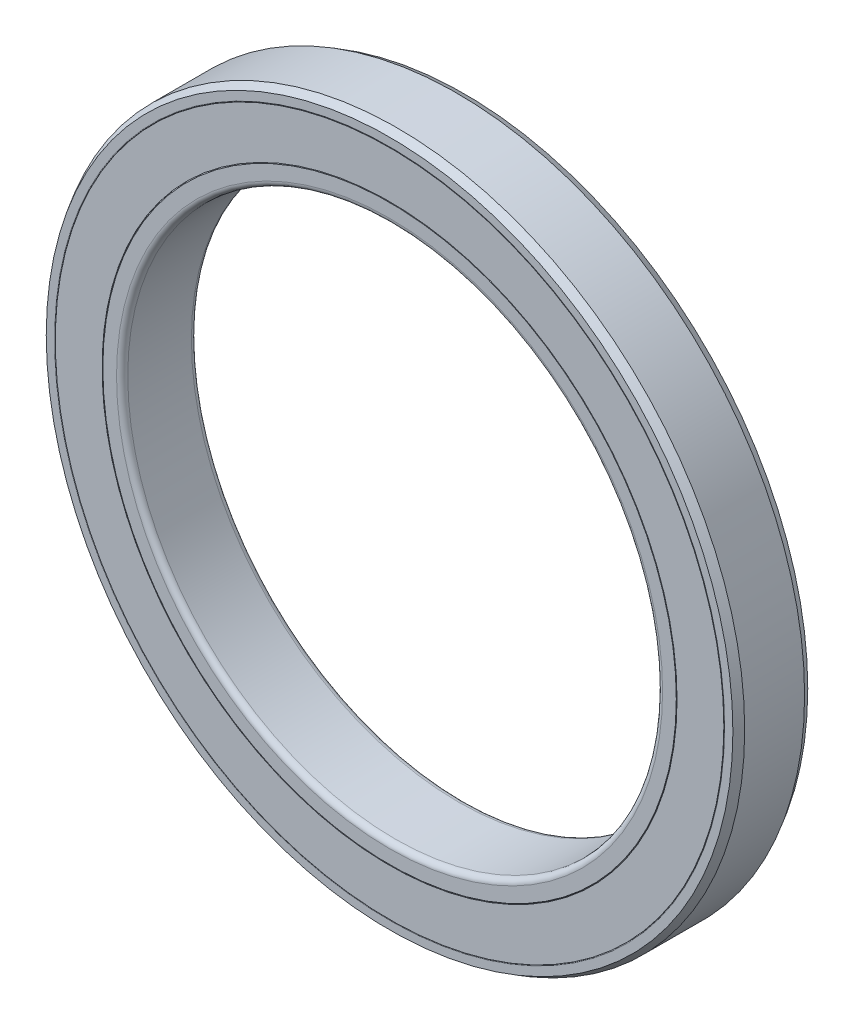
ISO-10303-21;
HEADER;
FILE_DESCRIPTION(('STEP AP214'),'2;1');
FILE_NAME('part.step','',(''),(''),'','','');
FILE_SCHEMA(('AUTOMOTIVE_DESIGN { 1 0 10303 214 1 1 1 1 }'));
ENDSEC;
DATA;
#1=APPLICATION_CONTEXT('core data for automotive mechanical design processes');
#2=APPLICATION_PROTOCOL_DEFINITION('international standard','automotive_design',2000,#1);
#3=PRODUCT_CONTEXT('',#1,'mechanical');
#4=PRODUCT('Part','Part','',(#3));
#5=PRODUCT_RELATED_PRODUCT_CATEGORY('part','',(#4));
#6=PRODUCT_DEFINITION_FORMATION('','',#4);
#7=PRODUCT_DEFINITION_CONTEXT('part definition',#1,'design');
#8=PRODUCT_DEFINITION('design','',#6,#7);
#9=PRODUCT_DEFINITION_SHAPE('','',#8);
#10=(LENGTH_UNIT() NAMED_UNIT(*) SI_UNIT(.MILLI.,.METRE.));
#11=(NAMED_UNIT(*) PLANE_ANGLE_UNIT() SI_UNIT($,.RADIAN.));
#12=(NAMED_UNIT(*) SI_UNIT($,.STERADIAN.) SOLID_ANGLE_UNIT());
#13=UNCERTAINTY_MEASURE_WITH_UNIT(LENGTH_MEASURE(1.E-05),#10,'distance_accuracy_value','');
#14=(GEOMETRIC_REPRESENTATION_CONTEXT(3) GLOBAL_UNCERTAINTY_ASSIGNED_CONTEXT((#13)) GLOBAL_UNIT_ASSIGNED_CONTEXT((#10,
#11,#12)) REPRESENTATION_CONTEXT('',''));
#15=CARTESIAN_POINT('',(0.,0.,0.));
#16=DIRECTION('',(0.,0.,1.));
#17=DIRECTION('',(1.,0.,0.));
#18=AXIS2_PLACEMENT_3D('',#15,#16,#17);
#19=CARTESIAN_POINT('',(22.7219774592269,-18.1201723665197,0.));
#20=DIRECTION('',(-0.781831482468022,0.623489801858743,0.));
#21=DIRECTION('',(0.,0.,1.));
#22=AXIS2_PLACEMENT_3D('',#19,#20,#21);
#23=SPHERICAL_SURFACE('',#22,3.02083333333333);
#24=CARTESIAN_POINT('',(20.3601948559381,-16.2367135900714,0.));
#25=VERTEX_POINT('',#24);
#26=VERTEX_LOOP('',#25);
#27=FACE_BOUND('',#26,.T.);
#28=ADVANCED_FACE('F46',(#27),#23,.T.);
#29=CLOSED_SHELL('',(#28));
#30=MANIFOLD_SOLID_BREP('B2',#29);
#31=CARTESIAN_POINT('',(28.3338424477843,6.46701464310512,0.));
#32=DIRECTION('',(-0.974927912181826,-0.222520933956305,0.));
#33=DIRECTION('',(0.,0.,1.));
#34=AXIS2_PLACEMENT_3D('',#31,#32,#33);
#35=SPHERICAL_SURFACE('',#34,3.02083333333333);
#36=CARTESIAN_POINT('',(25.3887477130684,5.79481598844544,0.));
#37=VERTEX_POINT('',#36);
#38=VERTEX_LOOP('',#37);
#39=FACE_BOUND('',#38,.T.);
#40=ADVANCED_FACE('F63',(#39),#35,.T.);
#41=CLOSED_SHELL('',(#40));
#42=MANIFOLD_SOLID_BREP('B6',#41);
#43=CARTESIAN_POINT('',(12.6097461681042,26.184407723414,0.));
#44=DIRECTION('',(-0.433883739117565,-0.900968867902416,0.));
#45=DIRECTION('',(0.,0.,1.));
#46=AXIS2_PLACEMENT_3D('',#43,#44,#45);
#47=SPHERICAL_SURFACE('',#46,3.02083333333333);
#48=CARTESIAN_POINT('',(11.2990557061866,23.4627309349587,0.));
#49=VERTEX_POINT('',#48);
#50=VERTEX_LOOP('',#49);
#51=FACE_BOUND('',#50,.T.);
#52=ADVANCED_FACE('F80',(#51),#47,.T.);
#53=CLOSED_SHELL('',(#52));
#54=MANIFOLD_SOLID_BREP('B42',#53);
#55=CARTESIAN_POINT('',(-12.6097461681039,26.1844077234141,0.));
#56=DIRECTION('',(0.433883739117553,-0.900968867902422,0.));
#57=DIRECTION('',(0.,0.,1.));
#58=AXIS2_PLACEMENT_3D('',#55,#56,#57);
#59=SPHERICAL_SURFACE('',#58,3.02083333333333);
#60=CARTESIAN_POINT('',(-11.2990557061863,23.4627309349589,0.));
#61=VERTEX_POINT('',#60);
#62=VERTEX_LOOP('',#61);
#63=FACE_BOUND('',#62,.T.);
#64=ADVANCED_FACE('F97',(#63),#59,.T.);
#65=CLOSED_SHELL('',(#64));
#66=MANIFOLD_SOLID_BREP('B59',#65);
#67=CARTESIAN_POINT('',(-28.3338424477842,6.4670146431055,0.));
#68=DIRECTION('',(0.974927912181823,-0.222520933956318,0.));
#69=DIRECTION('',(0.,0.,1.));
#70=AXIS2_PLACEMENT_3D('',#67,#68,#69);
#71=SPHERICAL_SURFACE('',#70,3.02083333333333);
#72=CARTESIAN_POINT('',(-25.3887477130683,5.79481598844579,0.));
#73=VERTEX_POINT('',#72);
#74=VERTEX_LOOP('',#73);
#75=FACE_BOUND('',#74,.T.);
#76=ADVANCED_FACE('F114',(#75),#71,.T.);
#77=CLOSED_SHELL('',(#76));
#78=MANIFOLD_SOLID_BREP('B76',#77);
#79=CARTESIAN_POINT('',(-22.7219774592272,-18.1201723665194,0.));
#80=DIRECTION('',(0.781831482468031,0.623489801858732,0.));
#81=DIRECTION('',(0.,0.,1.));
#82=AXIS2_PLACEMENT_3D('',#79,#80,#81);
#83=SPHERICAL_SURFACE('',#82,3.02083333333333);
#84=CARTESIAN_POINT('',(-20.3601948559383,-16.2367135900711,0.));
#85=VERTEX_POINT('',#84);
#86=VERTEX_LOOP('',#85);
#87=FACE_BOUND('',#86,.T.);
#88=ADVANCED_FACE('F131',(#87),#83,.T.);
#89=CLOSED_SHELL('',(#88));
#90=MANIFOLD_SOLID_BREP('B93',#89);
#91=CARTESIAN_POINT('',(0.,-29.0625,0.));
#92=DIRECTION('',(0.,1.,0.));
#93=DIRECTION('',(0.,0.,1.));
#94=AXIS2_PLACEMENT_3D('',#91,#92,#93);
#95=SPHERICAL_SURFACE('',#94,3.02083333333333);
#96=CARTESIAN_POINT('',(0.,-26.0416666666667,0.));
#97=VERTEX_POINT('',#96);
#98=VERTEX_LOOP('',#97);
#99=FACE_BOUND('',#98,.T.);
#100=ADVANCED_FACE('F150',(#99),#95,.T.);
#101=CLOSED_SHELL('',(#100));
#102=MANIFOLD_SOLID_BREP('B110',#101);
#103=CARTESIAN_POINT('',(0.,-26.875,3.5));
#104=DIRECTION('',(0.,0.,1.));
#105=DIRECTION('',(1.,0.,0.));
#106=AXIS2_PLACEMENT_3D('',#103,#104,#105);
#107=PLANE('',#106);
#108=CARTESIAN_POINT('',(0.,0.,3.5));
#109=DIRECTION('',(0.,0.,1.));
#110=DIRECTION('',(1.,0.,0.));
#111=AXIS2_PLACEMENT_3D('',#108,#109,#110);
#112=CIRCLE('',#111,31.25);
#113=CARTESIAN_POINT('',(31.25,0.,3.5));
#114=VERTEX_POINT('',#113);
#115=EDGE_CURVE('E149',#114,#114,#112,.T.);
#116=ORIENTED_EDGE('',*,*,#115,.T.);
#117=EDGE_LOOP('',(#116));
#118=FACE_BOUND('',#117,.T.);
#119=CARTESIAN_POINT('',(0.,0.,3.5));
#120=DIRECTION('',(0.,0.,1.));
#121=DIRECTION('',(1.,0.,0.));
#122=AXIS2_PLACEMENT_3D('',#119,#120,#121);
#123=CIRCLE('',#122,26.875);
#124=CARTESIAN_POINT('',(26.875,0.,3.5));
#125=VERTEX_POINT('',#124);
#126=EDGE_CURVE('E183',#125,#125,#123,.T.);
#127=ORIENTED_EDGE('',*,*,#126,.F.);
#128=EDGE_LOOP('',(#127));
#129=FACE_BOUND('',#128,.T.);
#130=ADVANCED_FACE('F169',(#118,#129),#107,.T.);
#131=CARTESIAN_POINT('',(0.,0.,3.5));
#132=DIRECTION('',(0.,0.,1.));
#133=DIRECTION('',(1.,0.,0.));
#134=AXIS2_PLACEMENT_3D('',#131,#132,#133);
#135=CYLINDRICAL_SURFACE('',#134,31.25);
#136=CARTESIAN_POINT('',(0.,0.,3.140625));
#137=DIRECTION('',(0.,0.,1.));
#138=DIRECTION('',(1.,0.,0.));
#139=AXIS2_PLACEMENT_3D('',#136,#137,#138);
#140=CIRCLE('',#139,31.25);
#141=CARTESIAN_POINT('',(31.25,0.,3.140625));
#142=VERTEX_POINT('',#141);
#143=EDGE_CURVE('E175',#142,#142,#140,.T.);
#144=ORIENTED_EDGE('',*,*,#143,.T.);
#145=EDGE_LOOP('',(#144));
#146=FACE_BOUND('',#145,.T.);
#147=ORIENTED_EDGE('',*,*,#115,.F.);
#148=EDGE_LOOP('',(#147));
#149=FACE_BOUND('',#148,.T.);
#150=ADVANCED_FACE('F193',(#146,#149),#135,.T.);
#151=CARTESIAN_POINT('',(0.,-26.875,3.140625));
#152=DIRECTION('',(0.,0.,-1.));
#153=DIRECTION('',(-1.,0.,0.));
#154=AXIS2_PLACEMENT_3D('',#151,#152,#153);
#155=PLANE('',#154);
#156=CARTESIAN_POINT('',(0.,0.,3.140625));
#157=DIRECTION('',(0.,0.,1.));
#158=DIRECTION('',(1.,0.,0.));
#159=AXIS2_PLACEMENT_3D('',#156,#157,#158);
#160=CIRCLE('',#159,26.875);
#161=CARTESIAN_POINT('',(26.875,0.,3.140625));
#162=VERTEX_POINT('',#161);
#163=EDGE_CURVE('E179',#162,#162,#160,.T.);
#164=ORIENTED_EDGE('',*,*,#163,.T.);
#165=EDGE_LOOP('',(#164));
#166=FACE_BOUND('',#165,.T.);
#167=ORIENTED_EDGE('',*,*,#143,.F.);
#168=EDGE_LOOP('',(#167));
#169=FACE_BOUND('',#168,.T.);
#170=ADVANCED_FACE('F197',(#166,#169),#155,.T.);
#171=CARTESIAN_POINT('',(0.,0.,3.5));
#172=DIRECTION('',(0.,0.,1.));
#173=DIRECTION('',(1.,0.,0.));
#174=AXIS2_PLACEMENT_3D('',#171,#172,#173);
#175=CYLINDRICAL_SURFACE('',#174,26.875);
#176=ORIENTED_EDGE('',*,*,#126,.T.);
#177=EDGE_LOOP('',(#176));
#178=FACE_BOUND('',#177,.T.);
#179=ORIENTED_EDGE('',*,*,#163,.F.);
#180=EDGE_LOOP('',(#179));
#181=FACE_BOUND('',#180,.T.);
#182=ADVANCED_FACE('F189',(#178,#181),#175,.F.);
#183=CLOSED_SHELL('',(#130,#150,#170,#182));
#184=MANIFOLD_SOLID_BREP('B127',#183);
#185=CARTESIAN_POINT('',(0.,0.,2.975));
#186=DIRECTION('',(0.,0.,1.));
#187=DIRECTION('',(1.,0.,0.));
#188=AXIS2_PLACEMENT_3D('',#185,#186,#187);
#189=TOROIDAL_SURFACE('',#188,25.525,0.525);
#190=CARTESIAN_POINT('',(0.,0.,3.5));
#191=DIRECTION('',(0.,0.,1.));
#192=DIRECTION('',(1.,0.,0.));
#193=AXIS2_PLACEMENT_3D('',#190,#191,#192);
#194=CIRCLE('',#193,25.525);
#195=CARTESIAN_POINT('',(25.525,0.,3.5));
#196=VERTEX_POINT('',#195);
#197=EDGE_CURVE('E168',#196,#196,#194,.T.);
#198=ORIENTED_EDGE('',*,*,#197,.T.);
#199=EDGE_LOOP('',(#198));
#200=FACE_BOUND('',#199,.T.);
#201=CARTESIAN_POINT('',(0.,0.,2.975));
#202=DIRECTION('',(0.,0.,1.));
#203=DIRECTION('',(1.,0.,0.));
#204=AXIS2_PLACEMENT_3D('',#201,#202,#203);
#205=CIRCLE('',#204,25.);
#206=CARTESIAN_POINT('',(25.,0.,2.975));
#207=VERTEX_POINT('',#206);
#208=EDGE_CURVE('E264',#207,#207,#205,.T.);
#209=ORIENTED_EDGE('',*,*,#208,.F.);
#210=EDGE_LOOP('',(#209));
#211=FACE_BOUND('',#210,.T.);
#212=ADVANCED_FACE('F230',(#200,#211),#189,.T.);
#213=CARTESIAN_POINT('',(0.,-26.805,3.5));
#214=DIRECTION('',(0.,0.,1.));
#215=DIRECTION('',(1.,0.,0.));
#216=AXIS2_PLACEMENT_3D('',#213,#214,#215);
#217=PLANE('',#216);
#218=CARTESIAN_POINT('',(0.,0.,3.5));
#219=DIRECTION('',(0.,0.,1.));
#220=DIRECTION('',(1.,0.,0.));
#221=AXIS2_PLACEMENT_3D('',#218,#219,#220);
#222=CIRCLE('',#221,26.805);
#223=CARTESIAN_POINT('',(26.805,0.,3.5));
#224=VERTEX_POINT('',#223);
#225=EDGE_CURVE('E236',#224,#224,#222,.T.);
#226=ORIENTED_EDGE('',*,*,#225,.T.);
#227=EDGE_LOOP('',(#226));
#228=FACE_BOUND('',#227,.T.);
#229=ORIENTED_EDGE('',*,*,#197,.F.);
#230=EDGE_LOOP('',(#229));
#231=FACE_BOUND('',#230,.T.);
#232=ADVANCED_FACE('F272',(#228,#231),#217,.T.);
#233=CARTESIAN_POINT('',(0.,0.,3.5));
#234=DIRECTION('',(0.,0.,-1.));
#235=DIRECTION('',(-1.,0.,0.));
#236=AXIS2_PLACEMENT_3D('',#233,#234,#235);
#237=CONICAL_SURFACE('',#236,26.805,0.78539816339743);
#238=CARTESIAN_POINT('',(0.,0.,3.43));
#239=DIRECTION('',(0.,0.,1.));
#240=DIRECTION('',(1.,0.,0.));
#241=AXIS2_PLACEMENT_3D('',#238,#239,#240);
#242=CIRCLE('',#241,26.875);
#243=CARTESIAN_POINT('',(26.875,0.,3.43));
#244=VERTEX_POINT('',#243);
#245=EDGE_CURVE('E240',#244,#244,#242,.T.);
#246=ORIENTED_EDGE('',*,*,#245,.T.);
#247=EDGE_LOOP('',(#246));
#248=FACE_BOUND('',#247,.T.);
#249=ORIENTED_EDGE('',*,*,#225,.F.);
#250=EDGE_LOOP('',(#249));
#251=FACE_BOUND('',#250,.T.);
#252=ADVANCED_FACE('F276',(#248,#251),#237,.T.);
#253=CARTESIAN_POINT('',(0.,0.,3.5));
#254=DIRECTION('',(0.,0.,1.));
#255=DIRECTION('',(1.,0.,0.));
#256=AXIS2_PLACEMENT_3D('',#253,#254,#255);
#257=CYLINDRICAL_SURFACE('',#256,26.875);
#258=CARTESIAN_POINT('',(0.,0.,2.08333333333333));
#259=DIRECTION('',(0.,0.,1.));
#260=DIRECTION('',(1.,0.,0.));
#261=AXIS2_PLACEMENT_3D('',#258,#259,#260);
#262=CIRCLE('',#261,26.875);
#263=CARTESIAN_POINT('',(26.875,0.,2.08333333333333));
#264=VERTEX_POINT('',#263);
#265=EDGE_CURVE('E244',#264,#264,#262,.T.);
#266=ORIENTED_EDGE('',*,*,#265,.T.);
#267=EDGE_LOOP('',(#266));
#268=FACE_BOUND('',#267,.T.);
#269=ORIENTED_EDGE('',*,*,#245,.F.);
#270=EDGE_LOOP('',(#269));
#271=FACE_BOUND('',#270,.T.);
#272=ADVANCED_FACE('F280',(#268,#271),#257,.T.);
#273=CARTESIAN_POINT('',(0.,0.,0.));
#274=DIRECTION('',(0.,0.,1.));
#275=DIRECTION('',(1.,0.,0.));
#276=AXIS2_PLACEMENT_3D('',#273,#274,#275);
#277=TOROIDAL_SURFACE('',#276,29.0625,3.02083333333333);
#278=CARTESIAN_POINT('',(0.,0.,-2.08333333333333));
#279=DIRECTION('',(0.,0.,1.));
#280=DIRECTION('',(1.,0.,0.));
#281=AXIS2_PLACEMENT_3D('',#278,#279,#280);
#282=CIRCLE('',#281,26.875);
#283=CARTESIAN_POINT('',(26.875,0.,-2.08333333333333));
#284=VERTEX_POINT('',#283);
#285=EDGE_CURVE('E249',#284,#284,#282,.T.);
#286=ORIENTED_EDGE('',*,*,#285,.T.);
#287=EDGE_LOOP('',(#286));
#288=FACE_BOUND('',#287,.T.);
#289=ORIENTED_EDGE('',*,*,#265,.F.);
#290=EDGE_LOOP('',(#289));
#291=FACE_BOUND('',#290,.T.);
#292=ADVANCED_FACE('F287',(#288,#291),#277,.F.);
#293=CARTESIAN_POINT('',(0.,0.,3.5));
#294=DIRECTION('',(0.,0.,1.));
#295=DIRECTION('',(1.,0.,0.));
#296=AXIS2_PLACEMENT_3D('',#293,#294,#295);
#297=CYLINDRICAL_SURFACE('',#296,26.875);
#298=CARTESIAN_POINT('',(0.,0.,-3.43));
#299=DIRECTION('',(0.,0.,1.));
#300=DIRECTION('',(1.,0.,0.));
#301=AXIS2_PLACEMENT_3D('',#298,#299,#300);
#302=CIRCLE('',#301,26.875);
#303=CARTESIAN_POINT('',(26.875,0.,-3.43));
#304=VERTEX_POINT('',#303);
#305=EDGE_CURVE('E252',#304,#304,#302,.T.);
#306=ORIENTED_EDGE('',*,*,#305,.T.);
#307=EDGE_LOOP('',(#306));
#308=FACE_BOUND('',#307,.T.);
#309=ORIENTED_EDGE('',*,*,#285,.F.);
#310=EDGE_LOOP('',(#309));
#311=FACE_BOUND('',#310,.T.);
#312=ADVANCED_FACE('F291',(#308,#311),#297,.T.);
#313=CARTESIAN_POINT('',(0.,0.,-3.43));
#314=DIRECTION('',(0.,0.,1.));
#315=DIRECTION('',(1.,0.,0.));
#316=AXIS2_PLACEMENT_3D('',#313,#314,#315);
#317=CONICAL_SURFACE('',#316,26.875,0.78539816339743);
#318=CARTESIAN_POINT('',(0.,0.,-3.5));
#319=DIRECTION('',(0.,0.,1.));
#320=DIRECTION('',(1.,0.,0.));
#321=AXIS2_PLACEMENT_3D('',#318,#319,#320);
#322=CIRCLE('',#321,26.805);
#323=CARTESIAN_POINT('',(26.805,0.,-3.5));
#324=VERTEX_POINT('',#323);
#325=EDGE_CURVE('E255',#324,#324,#322,.T.);
#326=ORIENTED_EDGE('',*,*,#325,.T.);
#327=EDGE_LOOP('',(#326));
#328=FACE_BOUND('',#327,.T.);
#329=ORIENTED_EDGE('',*,*,#305,.F.);
#330=EDGE_LOOP('',(#329));
#331=FACE_BOUND('',#330,.T.);
#332=ADVANCED_FACE('F295',(#328,#331),#317,.T.);
#333=CARTESIAN_POINT('',(0.,-26.805,-3.5));
#334=DIRECTION('',(0.,0.,-1.));
#335=DIRECTION('',(-1.,0.,0.));
#336=AXIS2_PLACEMENT_3D('',#333,#334,#335);
#337=PLANE('',#336);
#338=CARTESIAN_POINT('',(0.,0.,-3.5));
#339=DIRECTION('',(0.,0.,1.));
#340=DIRECTION('',(1.,0.,0.));
#341=AXIS2_PLACEMENT_3D('',#338,#339,#340);
#342=CIRCLE('',#341,25.525);
#343=CARTESIAN_POINT('',(25.525,0.,-3.5));
#344=VERTEX_POINT('',#343);
#345=EDGE_CURVE('E258',#344,#344,#342,.T.);
#346=ORIENTED_EDGE('',*,*,#345,.T.);
#347=EDGE_LOOP('',(#346));
#348=FACE_BOUND('',#347,.T.);
#349=ORIENTED_EDGE('',*,*,#325,.F.);
#350=EDGE_LOOP('',(#349));
#351=FACE_BOUND('',#350,.T.);
#352=ADVANCED_FACE('F299',(#348,#351),#337,.T.);
#353=CARTESIAN_POINT('',(0.,0.,-2.975));
#354=DIRECTION('',(0.,0.,1.));
#355=DIRECTION('',(1.,0.,0.));
#356=AXIS2_PLACEMENT_3D('',#353,#354,#355);
#357=TOROIDAL_SURFACE('',#356,25.525,0.525);
#358=CARTESIAN_POINT('',(0.,0.,-2.975));
#359=DIRECTION('',(0.,0.,1.));
#360=DIRECTION('',(1.,0.,0.));
#361=AXIS2_PLACEMENT_3D('',#358,#359,#360);
#362=CIRCLE('',#361,25.);
#363=CARTESIAN_POINT('',(25.,0.,-2.975));
#364=VERTEX_POINT('',#363);
#365=EDGE_CURVE('E261',#364,#364,#362,.T.);
#366=ORIENTED_EDGE('',*,*,#365,.T.);
#367=EDGE_LOOP('',(#366));
#368=FACE_BOUND('',#367,.T.);
#369=ORIENTED_EDGE('',*,*,#345,.F.);
#370=EDGE_LOOP('',(#369));
#371=FACE_BOUND('',#370,.T.);
#372=ADVANCED_FACE('F303',(#368,#371),#357,.T.);
#373=CARTESIAN_POINT('',(0.,0.,3.5));
#374=DIRECTION('',(0.,0.,1.));
#375=DIRECTION('',(1.,0.,0.));
#376=AXIS2_PLACEMENT_3D('',#373,#374,#375);
#377=CYLINDRICAL_SURFACE('',#376,25.);
#378=ORIENTED_EDGE('',*,*,#208,.T.);
#379=EDGE_LOOP('',(#378));
#380=FACE_BOUND('',#379,.T.);
#381=ORIENTED_EDGE('',*,*,#365,.F.);
#382=EDGE_LOOP('',(#381));
#383=FACE_BOUND('',#382,.T.);
#384=ADVANCED_FACE('F268',(#380,#383),#377,.F.);
#385=CLOSED_SHELL('',(#212,#232,#252,#272,#292,#312,#332,#352,#372,#384));
#386=MANIFOLD_SOLID_BREP('B144',#385);
#387=CARTESIAN_POINT('',(0.,0.,3.5));
#388=DIRECTION('',(0.,0.,-1.));
#389=DIRECTION('',(-1.,0.,0.));
#390=AXIS2_PLACEMENT_3D('',#387,#388,#389);
#391=CONICAL_SURFACE('',#390,32.0958548115673,0.523598775598285);
#392=CARTESIAN_POINT('',(0.,0.,2.8));
#393=DIRECTION('',(0.,0.,1.));
#394=DIRECTION('',(1.,0.,0.));
#395=AXIS2_PLACEMENT_3D('',#392,#393,#394);
#396=CIRCLE('',#395,32.5);
#397=CARTESIAN_POINT('',(32.5,0.,2.8));
#398=VERTEX_POINT('',#397);
#399=EDGE_CURVE('E229',#398,#398,#396,.T.);
#400=ORIENTED_EDGE('',*,*,#399,.T.);
#401=EDGE_LOOP('',(#400));
#402=FACE_BOUND('',#401,.T.);
#403=CARTESIAN_POINT('',(0.,0.,3.5));
#404=DIRECTION('',(0.,0.,1.));
#405=DIRECTION('',(1.,0.,0.));
#406=AXIS2_PLACEMENT_3D('',#403,#404,#405);
#407=CIRCLE('',#406,32.0958548115673);
#408=CARTESIAN_POINT('',(32.0958548115673,0.,3.5));
#409=VERTEX_POINT('',#408);
#410=EDGE_CURVE('E396',#409,#409,#407,.T.);
#411=ORIENTED_EDGE('',*,*,#410,.F.);
#412=EDGE_LOOP('',(#411));
#413=FACE_BOUND('',#412,.T.);
#414=ADVANCED_FACE('F362',(#402,#413),#391,.T.);
#415=CARTESIAN_POINT('',(0.,0.,3.5));
#416=DIRECTION('',(0.,0.,1.));
#417=DIRECTION('',(1.,0.,0.));
#418=AXIS2_PLACEMENT_3D('',#415,#416,#417);
#419=CYLINDRICAL_SURFACE('',#418,32.5);
#420=CARTESIAN_POINT('',(0.,0.,-2.8));
#421=DIRECTION('',(0.,0.,1.));
#422=DIRECTION('',(1.,0.,0.));
#423=AXIS2_PLACEMENT_3D('',#420,#421,#422);
#424=CIRCLE('',#423,32.5);
#425=CARTESIAN_POINT('',(32.5,0.,-2.8));
#426=VERTEX_POINT('',#425);
#427=EDGE_CURVE('E368',#426,#426,#424,.T.);
#428=ORIENTED_EDGE('',*,*,#427,.T.);
#429=EDGE_LOOP('',(#428));
#430=FACE_BOUND('',#429,.T.);
#431=ORIENTED_EDGE('',*,*,#399,.F.);
#432=EDGE_LOOP('',(#431));
#433=FACE_BOUND('',#432,.T.);
#434=ADVANCED_FACE('F404',(#430,#433),#419,.T.);
#435=CARTESIAN_POINT('',(0.,0.,-2.8));
#436=DIRECTION('',(0.,0.,1.));
#437=DIRECTION('',(1.,0.,0.));
#438=AXIS2_PLACEMENT_3D('',#435,#436,#437);
#439=CONICAL_SURFACE('',#438,32.5,0.523598775598286);
#440=CARTESIAN_POINT('',(0.,0.,-3.5));
#441=DIRECTION('',(0.,0.,1.));
#442=DIRECTION('',(1.,0.,0.));
#443=AXIS2_PLACEMENT_3D('',#440,#441,#442);
#444=CIRCLE('',#443,32.0958548115673);
#445=CARTESIAN_POINT('',(32.0958548115673,0.,-3.5));
#446=VERTEX_POINT('',#445);
#447=EDGE_CURVE('E372',#446,#446,#444,.T.);
#448=ORIENTED_EDGE('',*,*,#447,.T.);
#449=EDGE_LOOP('',(#448));
#450=FACE_BOUND('',#449,.T.);
#451=ORIENTED_EDGE('',*,*,#427,.F.);
#452=EDGE_LOOP('',(#451));
#453=FACE_BOUND('',#452,.T.);
#454=ADVANCED_FACE('F408',(#450,#453),#439,.T.);
#455=CARTESIAN_POINT('',(0.,-31.32,-3.5));
#456=DIRECTION('',(0.,0.,-1.));
#457=DIRECTION('',(-1.,0.,0.));
#458=AXIS2_PLACEMENT_3D('',#455,#456,#457);
#459=PLANE('',#458);
#460=CARTESIAN_POINT('',(0.,0.,-3.5));
#461=DIRECTION('',(0.,0.,1.));
#462=DIRECTION('',(1.,0.,0.));
#463=AXIS2_PLACEMENT_3D('',#460,#461,#462);
#464=CIRCLE('',#463,31.32);
#465=CARTESIAN_POINT('',(31.32,0.,-3.5));
#466=VERTEX_POINT('',#465);
#467=EDGE_CURVE('E376',#466,#466,#464,.T.);
#468=ORIENTED_EDGE('',*,*,#467,.T.);
#469=EDGE_LOOP('',(#468));
#470=FACE_BOUND('',#469,.T.);
#471=ORIENTED_EDGE('',*,*,#447,.F.);
#472=EDGE_LOOP('',(#471));
#473=FACE_BOUND('',#472,.T.);
#474=ADVANCED_FACE('F412',(#470,#473),#459,.T.);
#475=CARTESIAN_POINT('',(0.,0.,-3.43));
#476=DIRECTION('',(0.,0.,1.));
#477=DIRECTION('',(1.,0.,0.));
#478=AXIS2_PLACEMENT_3D('',#475,#476,#477);
#479=TOROIDAL_SURFACE('',#478,31.32,0.0700000000000037);
#480=CARTESIAN_POINT('',(0.,0.,-3.43));
#481=DIRECTION('',(0.,0.,1.));
#482=DIRECTION('',(1.,0.,0.));
#483=AXIS2_PLACEMENT_3D('',#480,#481,#482);
#484=CIRCLE('',#483,31.25);
#485=CARTESIAN_POINT('',(31.25,0.,-3.43));
#486=VERTEX_POINT('',#485);
#487=EDGE_CURVE('E381',#486,#486,#484,.T.);
#488=ORIENTED_EDGE('',*,*,#487,.T.);
#489=EDGE_LOOP('',(#488));
#490=FACE_BOUND('',#489,.T.);
#491=ORIENTED_EDGE('',*,*,#467,.F.);
#492=EDGE_LOOP('',(#491));
#493=FACE_BOUND('',#492,.T.);
#494=ADVANCED_FACE('F419',(#490,#493),#479,.T.);
#495=CARTESIAN_POINT('',(0.,0.,3.5));
#496=DIRECTION('',(0.,0.,1.));
#497=DIRECTION('',(1.,0.,0.));
#498=AXIS2_PLACEMENT_3D('',#495,#496,#497);
#499=CYLINDRICAL_SURFACE('',#498,31.25);
#500=CARTESIAN_POINT('',(0.,0.,-2.08333333333333));
#501=DIRECTION('',(0.,0.,1.));
#502=DIRECTION('',(1.,0.,0.));
#503=AXIS2_PLACEMENT_3D('',#500,#501,#502);
#504=CIRCLE('',#503,31.25);
#505=CARTESIAN_POINT('',(31.25,0.,-2.08333333333333));
#506=VERTEX_POINT('',#505);
#507=EDGE_CURVE('E384',#506,#506,#504,.T.);
#508=ORIENTED_EDGE('',*,*,#507,.T.);
#509=EDGE_LOOP('',(#508));
#510=FACE_BOUND('',#509,.T.);
#511=ORIENTED_EDGE('',*,*,#487,.F.);
#512=EDGE_LOOP('',(#511));
#513=FACE_BOUND('',#512,.T.);
#514=ADVANCED_FACE('F423',(#510,#513),#499,.F.);
#515=CARTESIAN_POINT('',(0.,0.,0.));
#516=DIRECTION('',(0.,0.,1.));
#517=DIRECTION('',(1.,0.,0.));
#518=AXIS2_PLACEMENT_3D('',#515,#516,#517);
#519=TOROIDAL_SURFACE('',#518,29.0625,3.02083333333333);
#520=CARTESIAN_POINT('',(0.,0.,2.08333333333333));
#521=DIRECTION('',(0.,0.,1.));
#522=DIRECTION('',(1.,0.,0.));
#523=AXIS2_PLACEMENT_3D('',#520,#521,#522);
#524=CIRCLE('',#523,31.25);
#525=CARTESIAN_POINT('',(31.25,0.,2.08333333333333));
#526=VERTEX_POINT('',#525);
#527=EDGE_CURVE('E387',#526,#526,#524,.T.);
#528=ORIENTED_EDGE('',*,*,#527,.T.);
#529=EDGE_LOOP('',(#528));
#530=FACE_BOUND('',#529,.T.);
#531=ORIENTED_EDGE('',*,*,#507,.F.);
#532=EDGE_LOOP('',(#531));
#533=FACE_BOUND('',#532,.T.);
#534=ADVANCED_FACE('F427',(#530,#533),#519,.F.);
#535=CARTESIAN_POINT('',(0.,0.,3.5));
#536=DIRECTION('',(0.,0.,1.));
#537=DIRECTION('',(1.,0.,0.));
#538=AXIS2_PLACEMENT_3D('',#535,#536,#537);
#539=CYLINDRICAL_SURFACE('',#538,31.25);
#540=CARTESIAN_POINT('',(0.,0.,3.43));
#541=DIRECTION('',(0.,0.,1.));
#542=DIRECTION('',(1.,0.,0.));
#543=AXIS2_PLACEMENT_3D('',#540,#541,#542);
#544=CIRCLE('',#543,31.25);
#545=CARTESIAN_POINT('',(31.25,0.,3.43));
#546=VERTEX_POINT('',#545);
#547=EDGE_CURVE('E390',#546,#546,#544,.T.);
#548=ORIENTED_EDGE('',*,*,#547,.T.);
#549=EDGE_LOOP('',(#548));
#550=FACE_BOUND('',#549,.T.);
#551=ORIENTED_EDGE('',*,*,#527,.F.);
#552=EDGE_LOOP('',(#551));
#553=FACE_BOUND('',#552,.T.);
#554=ADVANCED_FACE('F431',(#550,#553),#539,.F.);
#555=CARTESIAN_POINT('',(0.,0.,3.43));
#556=DIRECTION('',(0.,0.,1.));
#557=DIRECTION('',(1.,0.,0.));
#558=AXIS2_PLACEMENT_3D('',#555,#556,#557);
#559=TOROIDAL_SURFACE('',#558,31.32,0.0700000000000037);
#560=CARTESIAN_POINT('',(0.,0.,3.5));
#561=DIRECTION('',(0.,0.,1.));
#562=DIRECTION('',(1.,0.,0.));
#563=AXIS2_PLACEMENT_3D('',#560,#561,#562);
#564=CIRCLE('',#563,31.32);
#565=CARTESIAN_POINT('',(31.32,0.,3.5));
#566=VERTEX_POINT('',#565);
#567=EDGE_CURVE('E393',#566,#566,#564,.T.);
#568=ORIENTED_EDGE('',*,*,#567,.T.);
#569=EDGE_LOOP('',(#568));
#570=FACE_BOUND('',#569,.T.);
#571=ORIENTED_EDGE('',*,*,#547,.F.);
#572=EDGE_LOOP('',(#571));
#573=FACE_BOUND('',#572,.T.);
#574=ADVANCED_FACE('F435',(#570,#573),#559,.T.);
#575=CARTESIAN_POINT('',(0.,-31.32,3.5));
#576=DIRECTION('',(0.,0.,1.));
#577=DIRECTION('',(1.,0.,0.));
#578=AXIS2_PLACEMENT_3D('',#575,#576,#577);
#579=PLANE('',#578);
#580=ORIENTED_EDGE('',*,*,#410,.T.);
#581=EDGE_LOOP('',(#580));
#582=FACE_BOUND('',#581,.T.);
#583=ORIENTED_EDGE('',*,*,#567,.F.);
#584=EDGE_LOOP('',(#583));
#585=FACE_BOUND('',#584,.T.);
#586=ADVANCED_FACE('F400',(#582,#585),#579,.T.);
#587=CLOSED_SHELL('',(#414,#434,#454,#474,#494,#514,#534,#554,#574,#586));
#588=MANIFOLD_SOLID_BREP('B163',#587);
#589=ADVANCED_BREP_SHAPE_REPRESENTATION('',(#18,#30,#42,#54,#66,#78,#90,#102,#184,#386,#588),#14);
#590=SHAPE_DEFINITION_REPRESENTATION(#9,#589);
ENDSEC;
END-ISO-10303-21;
